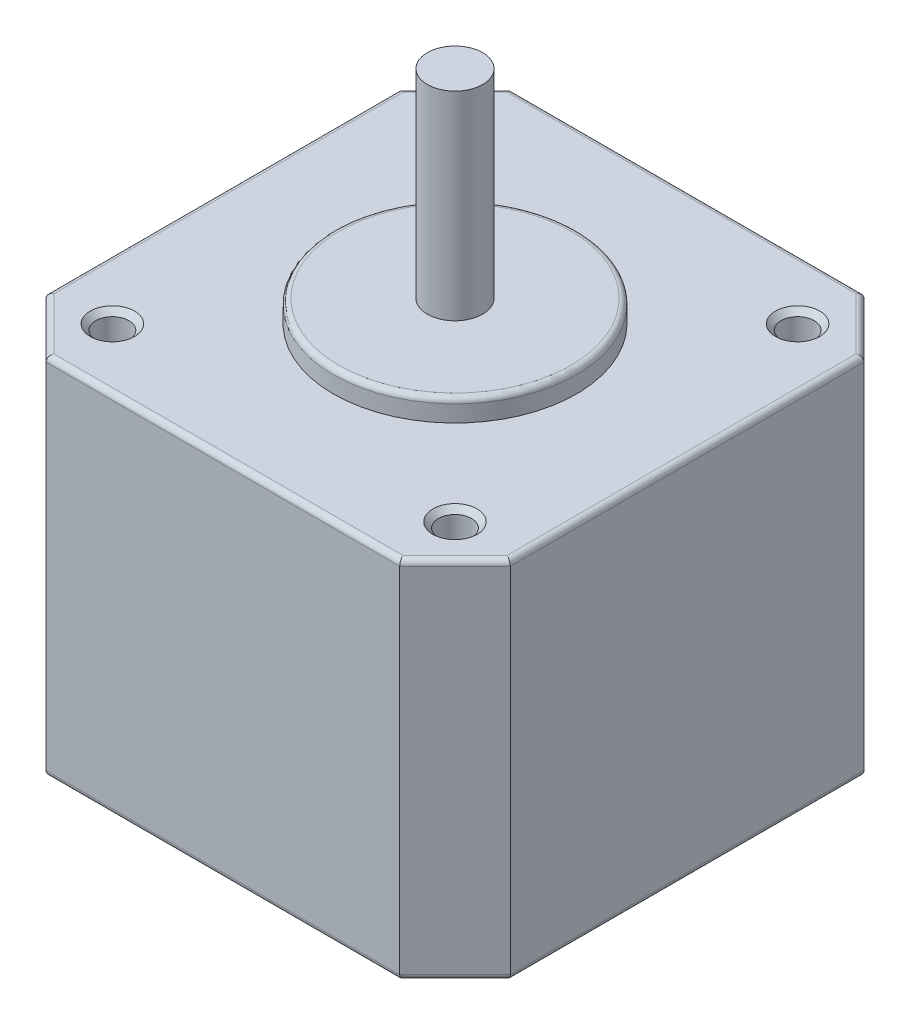
ISO-10303-21;
HEADER;
FILE_DESCRIPTION(('STEP AP214'),'2;1');
FILE_NAME('part.step','',(''),(''),'','','');
FILE_SCHEMA(('AUTOMOTIVE_DESIGN { 1 0 10303 214 1 1 1 1 }'));
ENDSEC;
DATA;
#1=APPLICATION_CONTEXT('core data for automotive mechanical design processes');
#2=APPLICATION_PROTOCOL_DEFINITION('international standard','automotive_design',2000,#1);
#3=PRODUCT_CONTEXT('',#1,'mechanical');
#4=PRODUCT('Part','Part','',(#3));
#5=PRODUCT_RELATED_PRODUCT_CATEGORY('part','',(#4));
#6=PRODUCT_DEFINITION_FORMATION('','',#4);
#7=PRODUCT_DEFINITION_CONTEXT('part definition',#1,'design');
#8=PRODUCT_DEFINITION('design','',#6,#7);
#9=PRODUCT_DEFINITION_SHAPE('','',#8);
#10=(LENGTH_UNIT() NAMED_UNIT(*) SI_UNIT(.MILLI.,.METRE.));
#11=(NAMED_UNIT(*) PLANE_ANGLE_UNIT() SI_UNIT($,.RADIAN.));
#12=(NAMED_UNIT(*) SI_UNIT($,.STERADIAN.) SOLID_ANGLE_UNIT());
#13=UNCERTAINTY_MEASURE_WITH_UNIT(LENGTH_MEASURE(1.E-05),#10,'distance_accuracy_value','');
#14=(GEOMETRIC_REPRESENTATION_CONTEXT(3) GLOBAL_UNCERTAINTY_ASSIGNED_CONTEXT((#13)) GLOBAL_UNIT_ASSIGNED_CONTEXT((#10,
#11,#12)) REPRESENTATION_CONTEXT('',''));
#15=CARTESIAN_POINT('',(0.,0.,0.));
#16=DIRECTION('',(0.,0.,1.));
#17=DIRECTION('',(1.,0.,0.));
#18=AXIS2_PLACEMENT_3D('',#15,#16,#17);
#19=CARTESIAN_POINT('',(-21.,33.,-21.));
#20=DIRECTION('',(1.,0.,0.));
#21=DIRECTION('',(0.,0.,-1.));
#22=AXIS2_PLACEMENT_3D('',#19,#20,#21);
#23=PLANE('',#22);
#24=DIRECTION('',(0.,-1.,0.));
#25=VECTOR('',#24,1.);
#26=CARTESIAN_POINT('',(-21.,33.,-16.));
#27=LINE('',#26,#25);
#28=CARTESIAN_POINT('',(-21.,32.5,-16.));
#29=VERTEX_POINT('',#28);
#30=CARTESIAN_POINT('',(-21.,0.5,-16.));
#31=VERTEX_POINT('',#30);
#32=EDGE_CURVE('E399',#29,#31,#27,.T.);
#33=ORIENTED_EDGE('',*,*,#32,.T.);
#34=DIRECTION('',(0.,0.,1.));
#35=VECTOR('',#34,1.);
#36=CARTESIAN_POINT('',(-21.,0.5,-21.));
#37=LINE('',#36,#35);
#38=CARTESIAN_POINT('',(-21.,0.5,16.));
#39=VERTEX_POINT('',#38);
#40=EDGE_CURVE('E201',#31,#39,#37,.T.);
#41=ORIENTED_EDGE('',*,*,#40,.T.);
#42=DIRECTION('',(0.,1.,0.));
#43=VECTOR('',#42,1.);
#44=CARTESIAN_POINT('',(-21.,33.,16.));
#45=LINE('',#44,#43);
#46=CARTESIAN_POINT('',(-21.,32.5,16.));
#47=VERTEX_POINT('',#46);
#48=EDGE_CURVE('E407',#39,#47,#45,.T.);
#49=ORIENTED_EDGE('',*,*,#48,.T.);
#50=DIRECTION('',(0.,0.,1.));
#51=VECTOR('',#50,1.);
#52=CARTESIAN_POINT('',(-21.,32.5,-16.));
#53=LINE('',#52,#51);
#54=EDGE_CURVE('E198',#47,#29,#53,.F.);
#55=ORIENTED_EDGE('',*,*,#54,.T.);
#56=EDGE_LOOP('',(#33,#41,#49,#55));
#57=FACE_BOUND('',#56,.T.);
#58=ADVANCED_FACE('F34',(#57),#23,.F.);
#59=CARTESIAN_POINT('',(-21.,33.,21.));
#60=DIRECTION('',(0.,0.,-1.));
#61=DIRECTION('',(-1.,0.,0.));
#62=AXIS2_PLACEMENT_3D('',#59,#60,#61);
#63=PLANE('',#62);
#64=DIRECTION('',(0.,-1.,0.));
#65=VECTOR('',#64,1.);
#66=CARTESIAN_POINT('',(-16.,33.,21.));
#67=LINE('',#66,#65);
#68=CARTESIAN_POINT('',(-16.,32.5,21.));
#69=VERTEX_POINT('',#68);
#70=CARTESIAN_POINT('',(-16.,0.5,21.));
#71=VERTEX_POINT('',#70);
#72=EDGE_CURVE('E396',#69,#71,#67,.T.);
#73=ORIENTED_EDGE('',*,*,#72,.T.);
#74=DIRECTION('',(1.,0.,0.));
#75=VECTOR('',#74,1.);
#76=CARTESIAN_POINT('',(-21.,0.5,21.));
#77=LINE('',#76,#75);
#78=CARTESIAN_POINT('',(16.,0.5,21.));
#79=VERTEX_POINT('',#78);
#80=EDGE_CURVE('E209',#71,#79,#77,.T.);
#81=ORIENTED_EDGE('',*,*,#80,.T.);
#82=DIRECTION('',(0.,1.,0.));
#83=VECTOR('',#82,1.);
#84=CARTESIAN_POINT('',(16.,33.,21.));
#85=LINE('',#84,#83);
#86=CARTESIAN_POINT('',(16.,32.5,21.));
#87=VERTEX_POINT('',#86);
#88=EDGE_CURVE('E391',#79,#87,#85,.T.);
#89=ORIENTED_EDGE('',*,*,#88,.T.);
#90=DIRECTION('',(1.,0.,0.));
#91=VECTOR('',#90,1.);
#92=CARTESIAN_POINT('',(-16.,32.5,21.));
#93=LINE('',#92,#91);
#94=EDGE_CURVE('E207',#87,#69,#93,.F.);
#95=ORIENTED_EDGE('',*,*,#94,.T.);
#96=EDGE_LOOP('',(#73,#81,#89,#95));
#97=FACE_BOUND('',#96,.T.);
#98=ADVANCED_FACE('F280',(#97),#63,.F.);
#99=CARTESIAN_POINT('',(21.,33.,-21.));
#100=DIRECTION('',(-1.,0.,0.));
#101=DIRECTION('',(0.,0.,1.));
#102=AXIS2_PLACEMENT_3D('',#99,#100,#101);
#103=PLANE('',#102);
#104=DIRECTION('',(0.,-1.,0.));
#105=VECTOR('',#104,1.);
#106=CARTESIAN_POINT('',(21.,33.,16.));
#107=LINE('',#106,#105);
#108=CARTESIAN_POINT('',(21.,32.5,16.));
#109=VERTEX_POINT('',#108);
#110=CARTESIAN_POINT('',(21.,0.5,16.));
#111=VERTEX_POINT('',#110);
#112=EDGE_CURVE('E393',#109,#111,#107,.T.);
#113=ORIENTED_EDGE('',*,*,#112,.T.);
#114=DIRECTION('',(0.,0.,-1.));
#115=VECTOR('',#114,1.);
#116=CARTESIAN_POINT('',(21.,0.5,-21.));
#117=LINE('',#116,#115);
#118=CARTESIAN_POINT('',(21.,0.5,-16.));
#119=VERTEX_POINT('',#118);
#120=EDGE_CURVE('E184',#111,#119,#117,.T.);
#121=ORIENTED_EDGE('',*,*,#120,.T.);
#122=DIRECTION('',(0.,1.,0.));
#123=VECTOR('',#122,1.);
#124=CARTESIAN_POINT('',(21.,33.,-16.));
#125=LINE('',#124,#123);
#126=CARTESIAN_POINT('',(21.,32.5,-16.));
#127=VERTEX_POINT('',#126);
#128=EDGE_CURVE('E417',#119,#127,#125,.T.);
#129=ORIENTED_EDGE('',*,*,#128,.T.);
#130=DIRECTION('',(0.,0.,-1.));
#131=VECTOR('',#130,1.);
#132=CARTESIAN_POINT('',(21.,32.5,16.));
#133=LINE('',#132,#131);
#134=EDGE_CURVE('E182',#127,#109,#133,.F.);
#135=ORIENTED_EDGE('',*,*,#134,.T.);
#136=EDGE_LOOP('',(#113,#121,#129,#135));
#137=FACE_BOUND('',#136,.T.);
#138=ADVANCED_FACE('F286',(#137),#103,.F.);
#139=CARTESIAN_POINT('',(-21.,33.,-21.));
#140=DIRECTION('',(0.,0.,1.));
#141=DIRECTION('',(1.,0.,0.));
#142=AXIS2_PLACEMENT_3D('',#139,#140,#141);
#143=PLANE('',#142);
#144=DIRECTION('',(0.,-1.,0.));
#145=VECTOR('',#144,1.);
#146=CARTESIAN_POINT('',(16.,33.,-21.));
#147=LINE('',#146,#145);
#148=CARTESIAN_POINT('',(16.,32.5,-21.));
#149=VERTEX_POINT('',#148);
#150=CARTESIAN_POINT('',(16.,0.5,-21.));
#151=VERTEX_POINT('',#150);
#152=EDGE_CURVE('E410',#149,#151,#147,.T.);
#153=ORIENTED_EDGE('',*,*,#152,.T.);
#154=DIRECTION('',(-1.,0.,0.));
#155=VECTOR('',#154,1.);
#156=CARTESIAN_POINT('',(-21.,0.5,-21.));
#157=LINE('',#156,#155);
#158=CARTESIAN_POINT('',(-16.,0.5,-21.));
#159=VERTEX_POINT('',#158);
#160=EDGE_CURVE('E192',#151,#159,#157,.T.);
#161=ORIENTED_EDGE('',*,*,#160,.T.);
#162=DIRECTION('',(0.,1.,0.));
#163=VECTOR('',#162,1.);
#164=CARTESIAN_POINT('',(-16.,33.,-21.));
#165=LINE('',#164,#163);
#166=CARTESIAN_POINT('',(-16.,32.5,-21.));
#167=VERTEX_POINT('',#166);
#168=EDGE_CURVE('E413',#159,#167,#165,.T.);
#169=ORIENTED_EDGE('',*,*,#168,.T.);
#170=DIRECTION('',(-1.,0.,0.));
#171=VECTOR('',#170,1.);
#172=CARTESIAN_POINT('',(16.,32.5,-21.));
#173=LINE('',#172,#171);
#174=EDGE_CURVE('E190',#167,#149,#173,.F.);
#175=ORIENTED_EDGE('',*,*,#174,.T.);
#176=EDGE_LOOP('',(#153,#161,#169,#175));
#177=FACE_BOUND('',#176,.T.);
#178=ADVANCED_FACE('F485',(#177),#143,.F.);
#179=CARTESIAN_POINT('',(0.,33.,0.));
#180=DIRECTION('',(0.,1.,0.));
#181=DIRECTION('',(0.,0.,1.));
#182=AXIS2_PLACEMENT_3D('',#179,#180,#181);
#183=PLANE('',#182);
#184=DIRECTION('',(-1.,0.,0.));
#185=VECTOR('',#184,1.);
#186=CARTESIAN_POINT('',(-16.,33.,-20.5));
#187=LINE('',#186,#185);
#188=CARTESIAN_POINT('',(15.7928932188135,33.,-20.5));
#189=VERTEX_POINT('',#188);
#190=CARTESIAN_POINT('',(-15.7928932188134,33.,-20.5));
#191=VERTEX_POINT('',#190);
#192=EDGE_CURVE('E49',#189,#191,#187,.T.);
#193=ORIENTED_EDGE('',*,*,#192,.T.);
#194=DIRECTION('',(0.707106781186549,0.,-0.707106781186546));
#195=VECTOR('',#194,1.);
#196=CARTESIAN_POINT('',(-18.1464466094067,33.,-18.1464466094068));
#197=LINE('',#196,#195);
#198=CARTESIAN_POINT('',(-20.5,33.,-15.7928932188134));
#199=VERTEX_POINT('',#198);
#200=EDGE_CURVE('E54',#191,#199,#197,.F.);
#201=ORIENTED_EDGE('',*,*,#200,.T.);
#202=DIRECTION('',(0.,0.,1.));
#203=VECTOR('',#202,1.);
#204=CARTESIAN_POINT('',(-20.5,33.,16.));
#205=LINE('',#204,#203);
#206=CARTESIAN_POINT('',(-20.5,33.,15.7928932188134));
#207=VERTEX_POINT('',#206);
#208=EDGE_CURVE('E221',#199,#207,#205,.T.);
#209=ORIENTED_EDGE('',*,*,#208,.T.);
#210=DIRECTION('',(-0.707106781186546,0.,-0.707106781186549));
#211=VECTOR('',#210,1.);
#212=CARTESIAN_POINT('',(-18.1464466094068,33.,18.1464466094067));
#213=LINE('',#212,#211);
#214=CARTESIAN_POINT('',(-15.7928932188134,33.,20.5));
#215=VERTEX_POINT('',#214);
#216=EDGE_CURVE('E211',#207,#215,#213,.F.);
#217=ORIENTED_EDGE('',*,*,#216,.T.);
#218=DIRECTION('',(1.,0.,0.));
#219=VECTOR('',#218,1.);
#220=CARTESIAN_POINT('',(16.,33.,20.5));
#221=LINE('',#220,#219);
#222=CARTESIAN_POINT('',(15.7928932188135,33.,20.5));
#223=VERTEX_POINT('',#222);
#224=EDGE_CURVE('E213',#215,#223,#221,.T.);
#225=ORIENTED_EDGE('',*,*,#224,.T.);
#226=DIRECTION('',(-0.707106781186548,0.,0.707106781186547));
#227=VECTOR('',#226,1.);
#228=CARTESIAN_POINT('',(18.1464466094067,33.,18.1464466094067));
#229=LINE('',#228,#227);
#230=CARTESIAN_POINT('',(20.5,33.,15.7928932188135));
#231=VERTEX_POINT('',#230);
#232=EDGE_CURVE('E215',#223,#231,#229,.F.);
#233=ORIENTED_EDGE('',*,*,#232,.T.);
#234=DIRECTION('',(0.,0.,-1.));
#235=VECTOR('',#234,1.);
#236=CARTESIAN_POINT('',(20.5,33.,-16.));
#237=LINE('',#236,#235);
#238=CARTESIAN_POINT('',(20.5,33.,-15.7928932188135));
#239=VERTEX_POINT('',#238);
#240=EDGE_CURVE('E217',#231,#239,#237,.T.);
#241=ORIENTED_EDGE('',*,*,#240,.T.);
#242=DIRECTION('',(0.707106781186547,0.,0.707106781186548));
#243=VECTOR('',#242,1.);
#244=CARTESIAN_POINT('',(18.1464466094067,33.,-18.1464466094067));
#245=LINE('',#244,#243);
#246=EDGE_CURVE('E219',#239,#189,#245,.F.);
#247=ORIENTED_EDGE('',*,*,#246,.T.);
#248=EDGE_LOOP('',(#193,#201,#209,#217,#225,#233,#241,#247));
#249=FACE_BOUND('',#248,.T.);
#250=CARTESIAN_POINT('',(15.5,33.,15.5));
#251=DIRECTION('',(0.,1.,0.));
#252=DIRECTION('',(0.,0.,1.));
#253=AXIS2_PLACEMENT_3D('',#250,#251,#252);
#254=CIRCLE('',#253,2.00000000000001);
#255=CARTESIAN_POINT('',(15.5,33.,17.5));
#256=VERTEX_POINT('',#255);
#257=EDGE_CURVE('E432',#256,#256,#254,.F.);
#258=ORIENTED_EDGE('',*,*,#257,.T.);
#259=EDGE_LOOP('',(#258));
#260=FACE_BOUND('',#259,.T.);
#261=CARTESIAN_POINT('',(-15.5,33.,15.5));
#262=DIRECTION('',(0.,1.,0.));
#263=DIRECTION('',(0.,0.,1.));
#264=AXIS2_PLACEMENT_3D('',#261,#262,#263);
#265=CIRCLE('',#264,2.00000000000001);
#266=CARTESIAN_POINT('',(-15.5,33.,17.5));
#267=VERTEX_POINT('',#266);
#268=EDGE_CURVE('E429',#267,#267,#265,.F.);
#269=ORIENTED_EDGE('',*,*,#268,.T.);
#270=EDGE_LOOP('',(#269));
#271=FACE_BOUND('',#270,.T.);
#272=CARTESIAN_POINT('',(-15.5,33.,-15.5));
#273=DIRECTION('',(0.,1.,0.));
#274=DIRECTION('',(0.,0.,1.));
#275=AXIS2_PLACEMENT_3D('',#272,#273,#274);
#276=CIRCLE('',#275,2.00000000000001);
#277=CARTESIAN_POINT('',(-15.5,33.,-13.5));
#278=VERTEX_POINT('',#277);
#279=EDGE_CURVE('E426',#278,#278,#276,.F.);
#280=ORIENTED_EDGE('',*,*,#279,.T.);
#281=EDGE_LOOP('',(#280));
#282=FACE_BOUND('',#281,.T.);
#283=CARTESIAN_POINT('',(15.5,33.,-15.5));
#284=DIRECTION('',(0.,1.,0.));
#285=DIRECTION('',(0.,0.,1.));
#286=AXIS2_PLACEMENT_3D('',#283,#284,#285);
#287=CIRCLE('',#286,2.00000000000001);
#288=CARTESIAN_POINT('',(15.5,33.,-13.5));
#289=VERTEX_POINT('',#288);
#290=EDGE_CURVE('E423',#289,#289,#287,.F.);
#291=ORIENTED_EDGE('',*,*,#290,.T.);
#292=EDGE_LOOP('',(#291));
#293=FACE_BOUND('',#292,.T.);
#294=CARTESIAN_POINT('',(0.,33.,0.));
#295=DIRECTION('',(0.,1.,0.));
#296=DIRECTION('',(0.,0.,1.));
#297=AXIS2_PLACEMENT_3D('',#294,#295,#296);
#298=CIRCLE('',#297,11.);
#299=CARTESIAN_POINT('',(0.,33.,11.));
#300=VERTEX_POINT('',#299);
#301=EDGE_CURVE('E402',#300,#300,#298,.T.);
#302=ORIENTED_EDGE('',*,*,#301,.F.);
#303=EDGE_LOOP('',(#302));
#304=FACE_BOUND('',#303,.T.);
#305=ADVANCED_FACE('F467',(#249,#260,#271,#282,#293,#304),#183,.T.);
#306=CARTESIAN_POINT('',(0.,0.,0.));
#307=DIRECTION('',(0.,1.,0.));
#308=DIRECTION('',(0.,0.,1.));
#309=AXIS2_PLACEMENT_3D('',#306,#307,#308);
#310=PLANE('',#309);
#311=DIRECTION('',(0.,0.,-1.));
#312=VECTOR('',#311,1.);
#313=CARTESIAN_POINT('',(20.5,0.,0.));
#314=LINE('',#313,#312);
#315=CARTESIAN_POINT('',(20.5,0.,-15.7928932188134));
#316=VERTEX_POINT('',#315);
#317=CARTESIAN_POINT('',(20.5,0.,15.7928932188135));
#318=VERTEX_POINT('',#317);
#319=EDGE_CURVE('E172',#316,#318,#314,.F.);
#320=ORIENTED_EDGE('',*,*,#319,.T.);
#321=DIRECTION('',(0.707106781186548,0.,-0.707106781186547));
#322=VECTOR('',#321,1.);
#323=CARTESIAN_POINT('',(15.6464466094067,0.,20.6464466094067));
#324=LINE('',#323,#322);
#325=CARTESIAN_POINT('',(15.7928932188135,0.,20.5));
#326=VERTEX_POINT('',#325);
#327=EDGE_CURVE('E152',#318,#326,#324,.F.);
#328=ORIENTED_EDGE('',*,*,#327,.T.);
#329=DIRECTION('',(1.,0.,0.));
#330=VECTOR('',#329,1.);
#331=CARTESIAN_POINT('',(0.,0.,20.5));
#332=LINE('',#331,#330);
#333=CARTESIAN_POINT('',(-15.7928932188134,0.,20.5));
#334=VERTEX_POINT('',#333);
#335=EDGE_CURVE('E161',#326,#334,#332,.F.);
#336=ORIENTED_EDGE('',*,*,#335,.T.);
#337=DIRECTION('',(0.707106781186546,0.,0.707106781186549));
#338=VECTOR('',#337,1.);
#339=CARTESIAN_POINT('',(-20.6464466094067,0.,15.6464466094067));
#340=LINE('',#339,#338);
#341=CARTESIAN_POINT('',(-20.5,0.,15.7928932188134));
#342=VERTEX_POINT('',#341);
#343=EDGE_CURVE('E167',#334,#342,#340,.F.);
#344=ORIENTED_EDGE('',*,*,#343,.T.);
#345=DIRECTION('',(0.,0.,1.));
#346=VECTOR('',#345,1.);
#347=CARTESIAN_POINT('',(-20.5,0.,0.));
#348=LINE('',#347,#346);
#349=CARTESIAN_POINT('',(-20.5,0.,-15.7928932188134));
#350=VERTEX_POINT('',#349);
#351=EDGE_CURVE('E444',#342,#350,#348,.F.);
#352=ORIENTED_EDGE('',*,*,#351,.T.);
#353=DIRECTION('',(-0.707106781186549,0.,0.707106781186546));
#354=VECTOR('',#353,1.);
#355=CARTESIAN_POINT('',(-15.6464466094067,0.,-20.6464466094067));
#356=LINE('',#355,#354);
#357=CARTESIAN_POINT('',(-15.7928932188134,0.,-20.5));
#358=VERTEX_POINT('',#357);
#359=EDGE_CURVE('E446',#350,#358,#356,.F.);
#360=ORIENTED_EDGE('',*,*,#359,.T.);
#361=DIRECTION('',(-1.,0.,0.));
#362=VECTOR('',#361,1.);
#363=CARTESIAN_POINT('',(0.,0.,-20.5));
#364=LINE('',#363,#362);
#365=CARTESIAN_POINT('',(15.7928932188135,0.,-20.5));
#366=VERTEX_POINT('',#365);
#367=EDGE_CURVE('E448',#358,#366,#364,.F.);
#368=ORIENTED_EDGE('',*,*,#367,.T.);
#369=DIRECTION('',(-0.707106781186547,0.,-0.707106781186548));
#370=VECTOR('',#369,1.);
#371=CARTESIAN_POINT('',(20.6464466094067,0.,-15.6464466094067));
#372=LINE('',#371,#370);
#373=EDGE_CURVE('E177',#366,#316,#372,.F.);
#374=ORIENTED_EDGE('',*,*,#373,.T.);
#375=EDGE_LOOP('',(#320,#328,#336,#344,#352,#360,#368,#374));
#376=FACE_BOUND('',#375,.T.);
#377=ADVANCED_FACE('F170',(#376),#310,.F.);
#378=CARTESIAN_POINT('',(0.,35.,0.));
#379=DIRECTION('',(0.,-1.,0.));
#380=DIRECTION('',(0.,0.,-1.));
#381=AXIS2_PLACEMENT_3D('',#378,#379,#380);
#382=CYLINDRICAL_SURFACE('',#381,11.);
#383=CARTESIAN_POINT('',(0.,34.5,0.));
#384=DIRECTION('',(0.,1.,0.));
#385=DIRECTION('',(0.,0.,1.));
#386=AXIS2_PLACEMENT_3D('',#383,#384,#385);
#387=CIRCLE('',#386,11.);
#388=CARTESIAN_POINT('',(0.,34.5,11.));
#389=VERTEX_POINT('',#388);
#390=EDGE_CURVE('E11',#389,#389,#387,.F.);
#391=ORIENTED_EDGE('',*,*,#390,.T.);
#392=EDGE_LOOP('',(#391));
#393=FACE_BOUND('',#392,.T.);
#394=ORIENTED_EDGE('',*,*,#301,.T.);
#395=EDGE_LOOP('',(#394));
#396=FACE_BOUND('',#395,.T.);
#397=ADVANCED_FACE('F495',(#393,#396),#382,.T.);
#398=CARTESIAN_POINT('',(0.,35.,0.));
#399=DIRECTION('',(0.,1.,0.));
#400=DIRECTION('',(0.,0.,1.));
#401=AXIS2_PLACEMENT_3D('',#398,#399,#400);
#402=PLANE('',#401);
#403=CARTESIAN_POINT('',(0.,35.,0.));
#404=DIRECTION('',(0.,1.,0.));
#405=DIRECTION('',(0.,0.,1.));
#406=AXIS2_PLACEMENT_3D('',#403,#404,#405);
#407=CIRCLE('',#406,10.5);
#408=CARTESIAN_POINT('',(0.,35.,10.5));
#409=VERTEX_POINT('',#408);
#410=EDGE_CURVE('E42',#409,#409,#407,.T.);
#411=ORIENTED_EDGE('',*,*,#410,.T.);
#412=EDGE_LOOP('',(#411));
#413=FACE_BOUND('',#412,.T.);
#414=CARTESIAN_POINT('',(0.,35.,0.));
#415=DIRECTION('',(0.,1.,0.));
#416=DIRECTION('',(0.,0.,1.));
#417=AXIS2_PLACEMENT_3D('',#414,#415,#416);
#418=CIRCLE('',#417,2.5);
#419=CARTESIAN_POINT('',(0.,35.,2.5));
#420=VERTEX_POINT('',#419);
#421=EDGE_CURVE('E397',#420,#420,#418,.T.);
#422=ORIENTED_EDGE('',*,*,#421,.F.);
#423=EDGE_LOOP('',(#422));
#424=FACE_BOUND('',#423,.T.);
#425=ADVANCED_FACE('F266',(#413,#424),#402,.T.);
#426=CARTESIAN_POINT('',(0.,53.,0.));
#427=DIRECTION('',(0.,-1.,0.));
#428=DIRECTION('',(0.,0.,-1.));
#429=AXIS2_PLACEMENT_3D('',#426,#427,#428);
#430=CYLINDRICAL_SURFACE('',#429,2.5);
#431=CARTESIAN_POINT('',(0.,53.,0.));
#432=DIRECTION('',(0.,1.,0.));
#433=DIRECTION('',(0.,0.,1.));
#434=AXIS2_PLACEMENT_3D('',#431,#432,#433);
#435=CIRCLE('',#434,2.5);
#436=CARTESIAN_POINT('',(0.,53.,2.5));
#437=VERTEX_POINT('',#436);
#438=EDGE_CURVE('E551',#437,#437,#435,.T.);
#439=ORIENTED_EDGE('',*,*,#438,.F.);
#440=EDGE_LOOP('',(#439));
#441=FACE_BOUND('',#440,.T.);
#442=ORIENTED_EDGE('',*,*,#421,.T.);
#443=EDGE_LOOP('',(#442));
#444=FACE_BOUND('',#443,.T.);
#445=ADVANCED_FACE('F502',(#441,#444),#430,.T.);
#446=CARTESIAN_POINT('',(0.,53.,0.));
#447=DIRECTION('',(0.,1.,0.));
#448=DIRECTION('',(0.,0.,1.));
#449=AXIS2_PLACEMENT_3D('',#446,#447,#448);
#450=PLANE('',#449);
#451=ORIENTED_EDGE('',*,*,#438,.T.);
#452=EDGE_LOOP('',(#451));
#453=FACE_BOUND('',#452,.T.);
#454=ADVANCED_FACE('F505',(#453),#450,.T.);
#455=CARTESIAN_POINT('',(-15.5,28.,15.5));
#456=DIRECTION('',(0.,1.,0.));
#457=DIRECTION('',(0.,0.,1.));
#458=AXIS2_PLACEMENT_3D('',#455,#456,#457);
#459=CYLINDRICAL_SURFACE('',#458,1.5);
#460=CARTESIAN_POINT('',(-15.5,32.5,15.5));
#461=DIRECTION('',(0.,1.,0.));
#462=DIRECTION('',(0.,0.,1.));
#463=AXIS2_PLACEMENT_3D('',#460,#461,#462);
#464=CIRCLE('',#463,1.5);
#465=CARTESIAN_POINT('',(-15.5,32.5,17.));
#466=VERTEX_POINT('',#465);
#467=EDGE_CURVE('E435',#466,#466,#464,.T.);
#468=ORIENTED_EDGE('',*,*,#467,.T.);
#469=EDGE_LOOP('',(#468));
#470=FACE_BOUND('',#469,.T.);
#471=CARTESIAN_POINT('',(-15.5,28.,15.5));
#472=DIRECTION('',(0.,1.,0.));
#473=DIRECTION('',(0.,0.,1.));
#474=AXIS2_PLACEMENT_3D('',#471,#472,#473);
#475=CIRCLE('',#474,1.5);
#476=CARTESIAN_POINT('',(-15.5,28.,17.));
#477=VERTEX_POINT('',#476);
#478=EDGE_CURVE('E547',#477,#477,#475,.T.);
#479=ORIENTED_EDGE('',*,*,#478,.F.);
#480=EDGE_LOOP('',(#479));
#481=FACE_BOUND('',#480,.T.);
#482=ADVANCED_FACE('F509',(#470,#481),#459,.F.);
#483=CARTESIAN_POINT('',(-15.5,28.,15.5));
#484=DIRECTION('',(0.,1.,0.));
#485=DIRECTION('',(0.,0.,1.));
#486=AXIS2_PLACEMENT_3D('',#483,#484,#485);
#487=PLANE('',#486);
#488=ORIENTED_EDGE('',*,*,#478,.T.);
#489=EDGE_LOOP('',(#488));
#490=FACE_BOUND('',#489,.T.);
#491=ADVANCED_FACE('F513',(#490),#487,.T.);
#492=CARTESIAN_POINT('',(15.5,28.,15.5));
#493=DIRECTION('',(0.,1.,0.));
#494=DIRECTION('',(0.,0.,1.));
#495=AXIS2_PLACEMENT_3D('',#492,#493,#494);
#496=CYLINDRICAL_SURFACE('',#495,1.5);
#497=CARTESIAN_POINT('',(15.5,32.5,15.5));
#498=DIRECTION('',(0.,1.,0.));
#499=DIRECTION('',(0.,0.,1.));
#500=AXIS2_PLACEMENT_3D('',#497,#498,#499);
#501=CIRCLE('',#500,1.5);
#502=CARTESIAN_POINT('',(15.5,32.5,17.));
#503=VERTEX_POINT('',#502);
#504=EDGE_CURVE('E420',#503,#503,#501,.T.);
#505=ORIENTED_EDGE('',*,*,#504,.T.);
#506=EDGE_LOOP('',(#505));
#507=FACE_BOUND('',#506,.T.);
#508=CARTESIAN_POINT('',(15.5,28.,15.5));
#509=DIRECTION('',(0.,1.,0.));
#510=DIRECTION('',(0.,0.,1.));
#511=AXIS2_PLACEMENT_3D('',#508,#509,#510);
#512=CIRCLE('',#511,1.5);
#513=CARTESIAN_POINT('',(15.5,28.,17.));
#514=VERTEX_POINT('',#513);
#515=EDGE_CURVE('E546',#514,#514,#512,.T.);
#516=ORIENTED_EDGE('',*,*,#515,.F.);
#517=EDGE_LOOP('',(#516));
#518=FACE_BOUND('',#517,.T.);
#519=ADVANCED_FACE('F517',(#507,#518),#496,.F.);
#520=CARTESIAN_POINT('',(15.5,28.,15.5));
#521=DIRECTION('',(0.,1.,0.));
#522=DIRECTION('',(0.,0.,1.));
#523=AXIS2_PLACEMENT_3D('',#520,#521,#522);
#524=PLANE('',#523);
#525=ORIENTED_EDGE('',*,*,#515,.T.);
#526=EDGE_LOOP('',(#525));
#527=FACE_BOUND('',#526,.T.);
#528=ADVANCED_FACE('F533',(#527),#524,.T.);
#529=CARTESIAN_POINT('',(15.5,28.,-15.5));
#530=DIRECTION('',(0.,1.,0.));
#531=DIRECTION('',(0.,0.,1.));
#532=AXIS2_PLACEMENT_3D('',#529,#530,#531);
#533=CYLINDRICAL_SURFACE('',#532,1.5);
#534=CARTESIAN_POINT('',(15.5,32.5,-15.5));
#535=DIRECTION('',(0.,1.,0.));
#536=DIRECTION('',(0.,0.,1.));
#537=AXIS2_PLACEMENT_3D('',#534,#535,#536);
#538=CIRCLE('',#537,1.5);
#539=CARTESIAN_POINT('',(15.5,32.5,-14.));
#540=VERTEX_POINT('',#539);
#541=EDGE_CURVE('E168',#540,#540,#538,.T.);
#542=ORIENTED_EDGE('',*,*,#541,.T.);
#543=EDGE_LOOP('',(#542));
#544=FACE_BOUND('',#543,.T.);
#545=CARTESIAN_POINT('',(15.5,28.,-15.5));
#546=DIRECTION('',(0.,1.,0.));
#547=DIRECTION('',(0.,0.,1.));
#548=AXIS2_PLACEMENT_3D('',#545,#546,#547);
#549=CIRCLE('',#548,1.5);
#550=CARTESIAN_POINT('',(15.5,28.,-14.));
#551=VERTEX_POINT('',#550);
#552=EDGE_CURVE('E548',#551,#551,#549,.T.);
#553=ORIENTED_EDGE('',*,*,#552,.F.);
#554=EDGE_LOOP('',(#553));
#555=FACE_BOUND('',#554,.T.);
#556=ADVANCED_FACE('F529',(#544,#555),#533,.F.);
#557=CARTESIAN_POINT('',(15.5,28.,-15.5));
#558=DIRECTION('',(0.,1.,0.));
#559=DIRECTION('',(0.,0.,1.));
#560=AXIS2_PLACEMENT_3D('',#557,#558,#559);
#561=PLANE('',#560);
#562=ORIENTED_EDGE('',*,*,#552,.T.);
#563=EDGE_LOOP('',(#562));
#564=FACE_BOUND('',#563,.T.);
#565=ADVANCED_FACE('F525',(#564),#561,.T.);
#566=CARTESIAN_POINT('',(-15.5,28.,-15.5));
#567=DIRECTION('',(0.,1.,0.));
#568=DIRECTION('',(0.,0.,1.));
#569=AXIS2_PLACEMENT_3D('',#566,#567,#568);
#570=CYLINDRICAL_SURFACE('',#569,1.5);
#571=CARTESIAN_POINT('',(-15.5,32.5,-15.5));
#572=DIRECTION('',(0.,1.,0.));
#573=DIRECTION('',(0.,0.,1.));
#574=AXIS2_PLACEMENT_3D('',#571,#572,#573);
#575=CIRCLE('',#574,1.5);
#576=CARTESIAN_POINT('',(-15.5,32.5,-14.));
#577=VERTEX_POINT('',#576);
#578=EDGE_CURVE('E438',#577,#577,#575,.T.);
#579=ORIENTED_EDGE('',*,*,#578,.T.);
#580=EDGE_LOOP('',(#579));
#581=FACE_BOUND('',#580,.T.);
#582=CARTESIAN_POINT('',(-15.5,28.,-15.5));
#583=DIRECTION('',(0.,1.,0.));
#584=DIRECTION('',(0.,0.,1.));
#585=AXIS2_PLACEMENT_3D('',#582,#583,#584);
#586=CIRCLE('',#585,1.5);
#587=CARTESIAN_POINT('',(-15.5,28.,-14.));
#588=VERTEX_POINT('',#587);
#589=EDGE_CURVE('E242',#588,#588,#586,.T.);
#590=ORIENTED_EDGE('',*,*,#589,.F.);
#591=EDGE_LOOP('',(#590));
#592=FACE_BOUND('',#591,.T.);
#593=ADVANCED_FACE('F521',(#581,#592),#570,.F.);
#594=CARTESIAN_POINT('',(-15.5,28.,-15.5));
#595=DIRECTION('',(0.,1.,0.));
#596=DIRECTION('',(0.,0.,1.));
#597=AXIS2_PLACEMENT_3D('',#594,#595,#596);
#598=PLANE('',#597);
#599=ORIENTED_EDGE('',*,*,#589,.T.);
#600=EDGE_LOOP('',(#599));
#601=FACE_BOUND('',#600,.T.);
#602=ADVANCED_FACE('F296',(#601),#598,.T.);
#603=CARTESIAN_POINT('',(-16.,33.,21.));
#604=DIRECTION('',(0.707106781186549,0.,-0.707106781186546));
#605=DIRECTION('',(0.,-1.,0.));
#606=AXIS2_PLACEMENT_3D('',#603,#604,#605);
#607=PLANE('',#606);
#608=ORIENTED_EDGE('',*,*,#48,.F.);
#609=DIRECTION('',(-0.707106781186546,0.,-0.707106781186549));
#610=VECTOR('',#609,1.);
#611=CARTESIAN_POINT('',(-16.,0.5,21.));
#612=LINE('',#611,#610);
#613=EDGE_CURVE('E205',#39,#71,#612,.F.);
#614=ORIENTED_EDGE('',*,*,#613,.T.);
#615=ORIENTED_EDGE('',*,*,#72,.F.);
#616=DIRECTION('',(0.707106781186546,0.,0.707106781186549));
#617=VECTOR('',#616,1.);
#618=CARTESIAN_POINT('',(-16.,32.5,21.));
#619=LINE('',#618,#617);
#620=EDGE_CURVE('E203',#69,#47,#619,.F.);
#621=ORIENTED_EDGE('',*,*,#620,.T.);
#622=EDGE_LOOP('',(#608,#614,#615,#621));
#623=FACE_BOUND('',#622,.T.);
#624=ADVANCED_FACE('F292',(#623),#607,.F.);
#625=CARTESIAN_POINT('',(-21.,33.,-16.));
#626=DIRECTION('',(0.707106781186546,0.,0.707106781186549));
#627=DIRECTION('',(0.,-1.,0.));
#628=AXIS2_PLACEMENT_3D('',#625,#626,#627);
#629=PLANE('',#628);
#630=ORIENTED_EDGE('',*,*,#168,.F.);
#631=DIRECTION('',(0.707106781186549,0.,-0.707106781186546));
#632=VECTOR('',#631,1.);
#633=CARTESIAN_POINT('',(-21.,0.5,-16.));
#634=LINE('',#633,#632);
#635=EDGE_CURVE('E196',#159,#31,#634,.F.);
#636=ORIENTED_EDGE('',*,*,#635,.T.);
#637=ORIENTED_EDGE('',*,*,#32,.F.);
#638=DIRECTION('',(-0.707106781186549,0.,0.707106781186546));
#639=VECTOR('',#638,1.);
#640=CARTESIAN_POINT('',(-21.,32.5,-16.));
#641=LINE('',#640,#639);
#642=EDGE_CURVE('E194',#29,#167,#641,.F.);
#643=ORIENTED_EDGE('',*,*,#642,.T.);
#644=EDGE_LOOP('',(#630,#636,#637,#643));
#645=FACE_BOUND('',#644,.T.);
#646=ADVANCED_FACE('F295',(#645),#629,.F.);
#647=CARTESIAN_POINT('',(16.,33.,-21.));
#648=DIRECTION('',(-0.707106781186548,0.,0.707106781186547));
#649=DIRECTION('',(0.,-1.,0.));
#650=AXIS2_PLACEMENT_3D('',#647,#648,#649);
#651=PLANE('',#650);
#652=ORIENTED_EDGE('',*,*,#128,.F.);
#653=DIRECTION('',(0.707106781186547,0.,0.707106781186548));
#654=VECTOR('',#653,1.);
#655=CARTESIAN_POINT('',(16.,0.5,-21.));
#656=LINE('',#655,#654);
#657=EDGE_CURVE('E188',#119,#151,#656,.F.);
#658=ORIENTED_EDGE('',*,*,#657,.T.);
#659=ORIENTED_EDGE('',*,*,#152,.F.);
#660=DIRECTION('',(-0.707106781186547,0.,-0.707106781186548));
#661=VECTOR('',#660,1.);
#662=CARTESIAN_POINT('',(16.,32.5,-21.));
#663=LINE('',#662,#661);
#664=EDGE_CURVE('E186',#149,#127,#663,.F.);
#665=ORIENTED_EDGE('',*,*,#664,.T.);
#666=EDGE_LOOP('',(#652,#658,#659,#665));
#667=FACE_BOUND('',#666,.T.);
#668=ADVANCED_FACE('F300',(#667),#651,.F.);
#669=CARTESIAN_POINT('',(21.,33.,16.));
#670=DIRECTION('',(-0.707106781186547,0.,-0.707106781186548));
#671=DIRECTION('',(0.,-1.,0.));
#672=AXIS2_PLACEMENT_3D('',#669,#670,#671);
#673=PLANE('',#672);
#674=ORIENTED_EDGE('',*,*,#88,.F.);
#675=DIRECTION('',(-0.707106781186548,0.,0.707106781186547));
#676=VECTOR('',#675,1.);
#677=CARTESIAN_POINT('',(21.,0.5,16.));
#678=LINE('',#677,#676);
#679=EDGE_CURVE('E154',#79,#111,#678,.F.);
#680=ORIENTED_EDGE('',*,*,#679,.T.);
#681=ORIENTED_EDGE('',*,*,#112,.F.);
#682=DIRECTION('',(0.707106781186548,0.,-0.707106781186547));
#683=VECTOR('',#682,1.);
#684=CARTESIAN_POINT('',(21.,32.5,16.));
#685=LINE('',#684,#683);
#686=EDGE_CURVE('E174',#109,#87,#685,.F.);
#687=ORIENTED_EDGE('',*,*,#686,.T.);
#688=EDGE_LOOP('',(#674,#680,#681,#687));
#689=FACE_BOUND('',#688,.T.);
#690=ADVANCED_FACE('F304',(#689),#673,.F.);
#691=CARTESIAN_POINT('',(15.5,32.5,15.5));
#692=DIRECTION('',(0.,1.,0.));
#693=DIRECTION('',(0.,0.,1.));
#694=AXIS2_PLACEMENT_3D('',#691,#692,#693);
#695=CONICAL_SURFACE('',#694,1.5,0.785398163397449);
#696=ORIENTED_EDGE('',*,*,#257,.F.);
#697=EDGE_LOOP('',(#696));
#698=FACE_BOUND('',#697,.T.);
#699=ORIENTED_EDGE('',*,*,#504,.F.);
#700=EDGE_LOOP('',(#699));
#701=FACE_BOUND('',#700,.T.);
#702=ADVANCED_FACE('F308',(#698,#701),#695,.F.);
#703=CARTESIAN_POINT('',(-15.5,32.5,15.5));
#704=DIRECTION('',(0.,1.,0.));
#705=DIRECTION('',(0.,0.,1.));
#706=AXIS2_PLACEMENT_3D('',#703,#704,#705);
#707=CONICAL_SURFACE('',#706,1.5,0.785398163397449);
#708=ORIENTED_EDGE('',*,*,#268,.F.);
#709=EDGE_LOOP('',(#708));
#710=FACE_BOUND('',#709,.T.);
#711=ORIENTED_EDGE('',*,*,#467,.F.);
#712=EDGE_LOOP('',(#711));
#713=FACE_BOUND('',#712,.T.);
#714=ADVANCED_FACE('F312',(#710,#713),#707,.F.);
#715=CARTESIAN_POINT('',(-15.5,32.5,-15.5));
#716=DIRECTION('',(0.,1.,0.));
#717=DIRECTION('',(0.,0.,1.));
#718=AXIS2_PLACEMENT_3D('',#715,#716,#717);
#719=CONICAL_SURFACE('',#718,1.5,0.785398163397449);
#720=ORIENTED_EDGE('',*,*,#279,.F.);
#721=EDGE_LOOP('',(#720));
#722=FACE_BOUND('',#721,.T.);
#723=ORIENTED_EDGE('',*,*,#578,.F.);
#724=EDGE_LOOP('',(#723));
#725=FACE_BOUND('',#724,.T.);
#726=ADVANCED_FACE('F316',(#722,#725),#719,.F.);
#727=CARTESIAN_POINT('',(15.5,32.5,-15.5));
#728=DIRECTION('',(0.,1.,0.));
#729=DIRECTION('',(0.,0.,1.));
#730=AXIS2_PLACEMENT_3D('',#727,#728,#729);
#731=CONICAL_SURFACE('',#730,1.5,0.785398163397449);
#732=ORIENTED_EDGE('',*,*,#290,.F.);
#733=EDGE_LOOP('',(#732));
#734=FACE_BOUND('',#733,.T.);
#735=ORIENTED_EDGE('',*,*,#541,.F.);
#736=EDGE_LOOP('',(#735));
#737=FACE_BOUND('',#736,.T.);
#738=ADVANCED_FACE('F320',(#734,#737),#731,.F.);
#739=CARTESIAN_POINT('',(-18.1464466094067,0.5,-18.1464466094068));
#740=DIRECTION('',(0.707106781186549,0.,-0.707106781186546));
#741=DIRECTION('',(-0.707106781186546,0.,-0.707106781186549));
#742=AXIS2_PLACEMENT_3D('',#739,#740,#741);
#743=CYLINDRICAL_SURFACE('',#742,0.5);
#744=CARTESIAN_POINT('',(-20.5,0.5,-15.7928932188134));
#745=DIRECTION('',(-0.382683432365091,0.,0.923879532511286));
#746=DIRECTION('',(0.923879532511286,0.,0.382683432365091));
#747=AXIS2_PLACEMENT_3D('',#744,#745,#746);
#748=ELLIPSE('',#747,0.541196100146197,0.5);
#749=EDGE_CURVE('E236',#31,#350,#748,.T.);
#750=ORIENTED_EDGE('',*,*,#749,.F.);
#751=ORIENTED_EDGE('',*,*,#635,.F.);
#752=CARTESIAN_POINT('',(-15.7928932188134,0.5,-20.5));
#753=DIRECTION('',(0.923879532511287,0.,-0.382683432365089));
#754=DIRECTION('',(-0.382683432365089,0.,-0.923879532511287));
#755=AXIS2_PLACEMENT_3D('',#752,#753,#754);
#756=ELLIPSE('',#755,0.541196100146197,0.5);
#757=EDGE_CURVE('E239',#358,#159,#756,.T.);
#758=ORIENTED_EDGE('',*,*,#757,.F.);
#759=ORIENTED_EDGE('',*,*,#359,.F.);
#760=EDGE_LOOP('',(#750,#751,#758,#759));
#761=FACE_BOUND('',#760,.T.);
#762=ADVANCED_FACE('F324',(#761),#743,.T.);
#763=CARTESIAN_POINT('',(-21.,0.5,-20.5));
#764=DIRECTION('',(-1.,0.,0.));
#765=DIRECTION('',(0.,0.,1.));
#766=AXIS2_PLACEMENT_3D('',#763,#764,#765);
#767=CYLINDRICAL_SURFACE('',#766,0.5);
#768=ORIENTED_EDGE('',*,*,#757,.T.);
#769=ORIENTED_EDGE('',*,*,#160,.F.);
#770=CARTESIAN_POINT('',(15.7928932188135,0.5,-20.5));
#771=DIRECTION('',(-0.923879532511287,0.,-0.38268343236509));
#772=DIRECTION('',(-0.38268343236509,0.,0.923879532511286));
#773=AXIS2_PLACEMENT_3D('',#770,#771,#772);
#774=ELLIPSE('',#773,0.541196100146197,0.5);
#775=EDGE_CURVE('E233',#366,#151,#774,.F.);
#776=ORIENTED_EDGE('',*,*,#775,.F.);
#777=ORIENTED_EDGE('',*,*,#367,.F.);
#778=EDGE_LOOP('',(#768,#769,#776,#777));
#779=FACE_BOUND('',#778,.T.);
#780=ADVANCED_FACE('F346',(#779),#767,.T.);
#781=CARTESIAN_POINT('',(-20.5,0.5,-21.));
#782=DIRECTION('',(0.,0.,1.));
#783=DIRECTION('',(1.,0.,0.));
#784=AXIS2_PLACEMENT_3D('',#781,#782,#783);
#785=CYLINDRICAL_SURFACE('',#784,0.5);
#786=ORIENTED_EDGE('',*,*,#749,.T.);
#787=ORIENTED_EDGE('',*,*,#351,.F.);
#788=CARTESIAN_POINT('',(-20.5,0.5,15.7928932188134));
#789=DIRECTION('',(-0.382683432365089,0.,-0.923879532511287));
#790=DIRECTION('',(-0.923879532511287,0.,0.382683432365089));
#791=AXIS2_PLACEMENT_3D('',#788,#789,#790);
#792=ELLIPSE('',#791,0.541196100146197,0.5);
#793=EDGE_CURVE('E230',#39,#342,#792,.F.);
#794=ORIENTED_EDGE('',*,*,#793,.F.);
#795=ORIENTED_EDGE('',*,*,#40,.F.);
#796=EDGE_LOOP('',(#786,#787,#794,#795));
#797=FACE_BOUND('',#796,.T.);
#798=ADVANCED_FACE('F342',(#797),#785,.T.);
#799=CARTESIAN_POINT('',(18.1464466094067,0.5,-18.1464466094067));
#800=DIRECTION('',(0.707106781186547,0.,0.707106781186548));
#801=DIRECTION('',(0.707106781186548,0.,-0.707106781186547));
#802=AXIS2_PLACEMENT_3D('',#799,#800,#801);
#803=CYLINDRICAL_SURFACE('',#802,0.5);
#804=ORIENTED_EDGE('',*,*,#775,.T.);
#805=ORIENTED_EDGE('',*,*,#657,.F.);
#806=CARTESIAN_POINT('',(20.5,0.5,-15.7928932188134));
#807=DIRECTION('',(0.382683432365089,0.,0.923879532511287));
#808=DIRECTION('',(0.923879532511287,0.,-0.382683432365089));
#809=AXIS2_PLACEMENT_3D('',#806,#807,#808);
#810=ELLIPSE('',#809,0.541196100146197,0.5);
#811=EDGE_CURVE('E227',#316,#119,#810,.T.);
#812=ORIENTED_EDGE('',*,*,#811,.F.);
#813=ORIENTED_EDGE('',*,*,#373,.F.);
#814=EDGE_LOOP('',(#804,#805,#812,#813));
#815=FACE_BOUND('',#814,.T.);
#816=ADVANCED_FACE('F338',(#815),#803,.T.);
#817=CARTESIAN_POINT('',(-18.1464466094068,0.5,18.1464466094067));
#818=DIRECTION('',(-0.707106781186546,0.,-0.707106781186549));
#819=DIRECTION('',(-0.707106781186549,0.,0.707106781186546));
#820=AXIS2_PLACEMENT_3D('',#817,#818,#819);
#821=CYLINDRICAL_SURFACE('',#820,0.5);
#822=ORIENTED_EDGE('',*,*,#793,.T.);
#823=ORIENTED_EDGE('',*,*,#343,.F.);
#824=CARTESIAN_POINT('',(-15.7928932188134,0.5,20.5));
#825=DIRECTION('',(0.923879532511287,0.,0.382683432365091));
#826=DIRECTION('',(0.382683432365091,0.,-0.923879532511287));
#827=AXIS2_PLACEMENT_3D('',#824,#825,#826);
#828=ELLIPSE('',#827,0.541196100146197,0.5);
#829=EDGE_CURVE('E164',#71,#334,#828,.T.);
#830=ORIENTED_EDGE('',*,*,#829,.F.);
#831=ORIENTED_EDGE('',*,*,#613,.F.);
#832=EDGE_LOOP('',(#822,#823,#830,#831));
#833=FACE_BOUND('',#832,.T.);
#834=ADVANCED_FACE('F334',(#833),#821,.T.);
#835=CARTESIAN_POINT('',(20.5,0.5,-21.));
#836=DIRECTION('',(0.,0.,-1.));
#837=DIRECTION('',(-1.,0.,0.));
#838=AXIS2_PLACEMENT_3D('',#835,#836,#837);
#839=CYLINDRICAL_SURFACE('',#838,0.5);
#840=ORIENTED_EDGE('',*,*,#811,.T.);
#841=ORIENTED_EDGE('',*,*,#120,.F.);
#842=CARTESIAN_POINT('',(20.5,0.5,15.7928932188135));
#843=DIRECTION('',(0.38268343236509,0.,-0.923879532511287));
#844=DIRECTION('',(-0.923879532511286,0.,-0.38268343236509));
#845=AXIS2_PLACEMENT_3D('',#842,#843,#844);
#846=ELLIPSE('',#845,0.541196100146197,0.5);
#847=EDGE_CURVE('E157',#318,#111,#846,.F.);
#848=ORIENTED_EDGE('',*,*,#847,.F.);
#849=ORIENTED_EDGE('',*,*,#319,.F.);
#850=EDGE_LOOP('',(#840,#841,#848,#849));
#851=FACE_BOUND('',#850,.T.);
#852=ADVANCED_FACE('F331',(#851),#839,.T.);
#853=CARTESIAN_POINT('',(-21.,0.5,20.5));
#854=DIRECTION('',(1.,0.,0.));
#855=DIRECTION('',(0.,0.,-1.));
#856=AXIS2_PLACEMENT_3D('',#853,#854,#855);
#857=CYLINDRICAL_SURFACE('',#856,0.5);
#858=ORIENTED_EDGE('',*,*,#829,.T.);
#859=ORIENTED_EDGE('',*,*,#335,.F.);
#860=CARTESIAN_POINT('',(15.7928932188135,0.5,20.5));
#861=DIRECTION('',(0.923879532511287,0.,-0.382683432365089));
#862=DIRECTION('',(0.382683432365089,0.,0.923879532511287));
#863=AXIS2_PLACEMENT_3D('',#860,#861,#862);
#864=ELLIPSE('',#863,0.541196100146197,0.5);
#865=EDGE_CURVE('E148',#79,#326,#864,.T.);
#866=ORIENTED_EDGE('',*,*,#865,.F.);
#867=ORIENTED_EDGE('',*,*,#80,.F.);
#868=EDGE_LOOP('',(#858,#859,#866,#867));
#869=FACE_BOUND('',#868,.T.);
#870=ADVANCED_FACE('F162',(#869),#857,.T.);
#871=CARTESIAN_POINT('',(18.1464466094067,0.5,18.1464466094068));
#872=DIRECTION('',(-0.707106781186548,0.,0.707106781186547));
#873=DIRECTION('',(0.707106781186547,0.,0.707106781186548));
#874=AXIS2_PLACEMENT_3D('',#871,#872,#873);
#875=CYLINDRICAL_SURFACE('',#874,0.5);
#876=ORIENTED_EDGE('',*,*,#847,.T.);
#877=ORIENTED_EDGE('',*,*,#679,.F.);
#878=ORIENTED_EDGE('',*,*,#865,.T.);
#879=ORIENTED_EDGE('',*,*,#327,.F.);
#880=EDGE_LOOP('',(#876,#877,#878,#879));
#881=FACE_BOUND('',#880,.T.);
#882=ADVANCED_FACE('F150',(#881),#875,.T.);
#883=CARTESIAN_POINT('',(20.5,32.5,0.));
#884=DIRECTION('',(0.,0.,1.));
#885=DIRECTION('',(1.,0.,0.));
#886=AXIS2_PLACEMENT_3D('',#883,#884,#885);
#887=CYLINDRICAL_SURFACE('',#886,0.5);
#888=CARTESIAN_POINT('',(20.5,32.5,15.7928932188135));
#889=DIRECTION('',(-0.38268343236509,0.,0.923879532511287));
#890=DIRECTION('',(-0.923879532511286,0.,-0.38268343236509));
#891=AXIS2_PLACEMENT_3D('',#888,#889,#890);
#892=ELLIPSE('',#891,0.541196100146197,0.5);
#893=EDGE_CURVE('E259',#109,#231,#892,.T.);
#894=ORIENTED_EDGE('',*,*,#893,.F.);
#895=ORIENTED_EDGE('',*,*,#134,.F.);
#896=CARTESIAN_POINT('',(20.5,32.5,-15.7928932188134));
#897=DIRECTION('',(0.382683432365089,0.,0.923879532511287));
#898=DIRECTION('',(-0.923879532511287,0.,0.382683432365089));
#899=AXIS2_PLACEMENT_3D('',#896,#897,#898);
#900=ELLIPSE('',#899,0.541196100146197,0.5);
#901=EDGE_CURVE('E158',#239,#127,#900,.F.);
#902=ORIENTED_EDGE('',*,*,#901,.F.);
#903=ORIENTED_EDGE('',*,*,#240,.F.);
#904=EDGE_LOOP('',(#894,#895,#902,#903));
#905=FACE_BOUND('',#904,.T.);
#906=ADVANCED_FACE('F328',(#905),#887,.T.);
#907=CARTESIAN_POINT('',(18.1464466094067,32.5,-18.1464466094067));
#908=DIRECTION('',(0.707106781186547,0.,0.707106781186548));
#909=DIRECTION('',(0.707106781186548,0.,-0.707106781186547));
#910=AXIS2_PLACEMENT_3D('',#907,#908,#909);
#911=CYLINDRICAL_SURFACE('',#910,0.5);
#912=ORIENTED_EDGE('',*,*,#901,.T.);
#913=ORIENTED_EDGE('',*,*,#664,.F.);
#914=CARTESIAN_POINT('',(15.7928932188135,32.5,-20.5));
#915=DIRECTION('',(0.923879532511287,0.,0.38268343236509));
#916=DIRECTION('',(0.38268343236509,0.,-0.923879532511286));
#917=AXIS2_PLACEMENT_3D('',#914,#915,#916);
#918=ELLIPSE('',#917,0.541196100146197,0.5);
#919=EDGE_CURVE('E256',#189,#149,#918,.F.);
#920=ORIENTED_EDGE('',*,*,#919,.F.);
#921=ORIENTED_EDGE('',*,*,#246,.F.);
#922=EDGE_LOOP('',(#912,#913,#920,#921));
#923=FACE_BOUND('',#922,.T.);
#924=ADVANCED_FACE('F372',(#923),#911,.T.);
#925=CARTESIAN_POINT('',(18.1464466094067,32.5,18.1464466094068));
#926=DIRECTION('',(-0.707106781186548,0.,0.707106781186547));
#927=DIRECTION('',(0.707106781186547,0.,0.707106781186548));
#928=AXIS2_PLACEMENT_3D('',#925,#926,#927);
#929=CYLINDRICAL_SURFACE('',#928,0.5);
#930=ORIENTED_EDGE('',*,*,#893,.T.);
#931=ORIENTED_EDGE('',*,*,#232,.F.);
#932=CARTESIAN_POINT('',(15.7928932188135,32.5,20.5));
#933=DIRECTION('',(-0.923879532511287,0.,0.382683432365089));
#934=DIRECTION('',(-0.382683432365089,0.,-0.923879532511287));
#935=AXIS2_PLACEMENT_3D('',#932,#933,#934);
#936=ELLIPSE('',#935,0.541196100146197,0.5);
#937=EDGE_CURVE('E253',#87,#223,#936,.T.);
#938=ORIENTED_EDGE('',*,*,#937,.F.);
#939=ORIENTED_EDGE('',*,*,#686,.F.);
#940=EDGE_LOOP('',(#930,#931,#938,#939));
#941=FACE_BOUND('',#940,.T.);
#942=ADVANCED_FACE('F368',(#941),#929,.T.);
#943=CARTESIAN_POINT('',(0.,32.5,-20.5));
#944=DIRECTION('',(1.,0.,0.));
#945=DIRECTION('',(0.,0.,-1.));
#946=AXIS2_PLACEMENT_3D('',#943,#944,#945);
#947=CYLINDRICAL_SURFACE('',#946,0.5);
#948=ORIENTED_EDGE('',*,*,#919,.T.);
#949=ORIENTED_EDGE('',*,*,#174,.F.);
#950=CARTESIAN_POINT('',(-15.7928932188134,32.5,-20.5));
#951=DIRECTION('',(0.923879532511287,0.,-0.382683432365089));
#952=DIRECTION('',(0.382683432365089,0.,0.923879532511287));
#953=AXIS2_PLACEMENT_3D('',#950,#951,#952);
#954=ELLIPSE('',#953,0.541196100146197,0.5);
#955=EDGE_CURVE('E250',#191,#167,#954,.F.);
#956=ORIENTED_EDGE('',*,*,#955,.F.);
#957=ORIENTED_EDGE('',*,*,#192,.F.);
#958=EDGE_LOOP('',(#948,#949,#956,#957));
#959=FACE_BOUND('',#958,.T.);
#960=ADVANCED_FACE('F364',(#959),#947,.T.);
#961=CARTESIAN_POINT('',(0.,32.5,20.5));
#962=DIRECTION('',(-1.,0.,0.));
#963=DIRECTION('',(0.,0.,1.));
#964=AXIS2_PLACEMENT_3D('',#961,#962,#963);
#965=CYLINDRICAL_SURFACE('',#964,0.5);
#966=ORIENTED_EDGE('',*,*,#937,.T.);
#967=ORIENTED_EDGE('',*,*,#224,.F.);
#968=CARTESIAN_POINT('',(-15.7928932188134,32.5,20.5));
#969=DIRECTION('',(-0.923879532511287,0.,-0.382683432365091));
#970=DIRECTION('',(0.382683432365091,0.,-0.923879532511287));
#971=AXIS2_PLACEMENT_3D('',#968,#969,#970);
#972=ELLIPSE('',#971,0.541196100146197,0.5);
#973=EDGE_CURVE('E247',#69,#215,#972,.T.);
#974=ORIENTED_EDGE('',*,*,#973,.F.);
#975=ORIENTED_EDGE('',*,*,#94,.F.);
#976=EDGE_LOOP('',(#966,#967,#974,#975));
#977=FACE_BOUND('',#976,.T.);
#978=ADVANCED_FACE('F360',(#977),#965,.T.);
#979=CARTESIAN_POINT('',(-18.1464466094067,32.5,-18.1464466094068));
#980=DIRECTION('',(0.707106781186549,0.,-0.707106781186546));
#981=DIRECTION('',(-0.707106781186546,0.,-0.707106781186549));
#982=AXIS2_PLACEMENT_3D('',#979,#980,#981);
#983=CYLINDRICAL_SURFACE('',#982,0.5);
#984=ORIENTED_EDGE('',*,*,#955,.T.);
#985=ORIENTED_EDGE('',*,*,#642,.F.);
#986=CARTESIAN_POINT('',(-20.5,32.5,-15.7928932188134));
#987=DIRECTION('',(0.382683432365091,0.,-0.923879532511286));
#988=DIRECTION('',(0.923879532511286,0.,0.382683432365091));
#989=AXIS2_PLACEMENT_3D('',#986,#987,#988);
#990=ELLIPSE('',#989,0.541196100146197,0.5);
#991=EDGE_CURVE('E245',#199,#29,#990,.F.);
#992=ORIENTED_EDGE('',*,*,#991,.F.);
#993=ORIENTED_EDGE('',*,*,#200,.F.);
#994=EDGE_LOOP('',(#984,#985,#992,#993));
#995=FACE_BOUND('',#994,.T.);
#996=ADVANCED_FACE('F356',(#995),#983,.T.);
#997=CARTESIAN_POINT('',(-18.1464466094068,32.5,18.1464466094067));
#998=DIRECTION('',(-0.707106781186546,0.,-0.707106781186549));
#999=DIRECTION('',(-0.707106781186549,0.,0.707106781186546));
#1000=AXIS2_PLACEMENT_3D('',#997,#998,#999);
#1001=CYLINDRICAL_SURFACE('',#1000,0.5);
#1002=ORIENTED_EDGE('',*,*,#973,.T.);
#1003=ORIENTED_EDGE('',*,*,#216,.F.);
#1004=CARTESIAN_POINT('',(-20.5,32.5,15.7928932188134));
#1005=DIRECTION('',(-0.382683432365089,0.,-0.923879532511287));
#1006=DIRECTION('',(-0.923879532511287,0.,0.382683432365089));
#1007=AXIS2_PLACEMENT_3D('',#1004,#1005,#1006);
#1008=ELLIPSE('',#1007,0.541196100146197,0.5);
#1009=EDGE_CURVE('E243',#47,#207,#1008,.T.);
#1010=ORIENTED_EDGE('',*,*,#1009,.F.);
#1011=ORIENTED_EDGE('',*,*,#620,.F.);
#1012=EDGE_LOOP('',(#1002,#1003,#1010,#1011));
#1013=FACE_BOUND('',#1012,.T.);
#1014=ADVANCED_FACE('F275',(#1013),#1001,.T.);
#1015=CARTESIAN_POINT('',(-20.5,32.5,0.));
#1016=DIRECTION('',(0.,0.,-1.));
#1017=DIRECTION('',(-1.,0.,0.));
#1018=AXIS2_PLACEMENT_3D('',#1015,#1016,#1017);
#1019=CYLINDRICAL_SURFACE('',#1018,0.5);
#1020=ORIENTED_EDGE('',*,*,#991,.T.);
#1021=ORIENTED_EDGE('',*,*,#54,.F.);
#1022=ORIENTED_EDGE('',*,*,#1009,.T.);
#1023=ORIENTED_EDGE('',*,*,#208,.F.);
#1024=EDGE_LOOP('',(#1020,#1021,#1022,#1023));
#1025=FACE_BOUND('',#1024,.T.);
#1026=ADVANCED_FACE('F270',(#1025),#1019,.T.);
#1027=CARTESIAN_POINT('',(0.,34.5,0.));
#1028=DIRECTION('',(0.,1.,0.));
#1029=DIRECTION('',(0.,0.,1.));
#1030=AXIS2_PLACEMENT_3D('',#1027,#1028,#1029);
#1031=TOROIDAL_SURFACE('',#1030,10.5,0.5);
#1032=ORIENTED_EDGE('',*,*,#390,.F.);
#1033=EDGE_LOOP('',(#1032));
#1034=FACE_BOUND('',#1033,.T.);
#1035=ORIENTED_EDGE('',*,*,#410,.F.);
#1036=EDGE_LOOP('',(#1035));
#1037=FACE_BOUND('',#1036,.T.);
#1038=ADVANCED_FACE('F36',(#1034,#1037),#1031,.T.);
#1039=CLOSED_SHELL('',(#58,#98,#138,#178,#305,#377,#397,#425,#445,#454,#482,#491,#519,#528,#556,
#565,#593,#602,#624,#646,#668,#690,#702,#714,#726,#738,#762,#780,#798,#816,#834,#852,#870,#882,
#906,#924,#942,#960,#978,#996,#1014,#1026,#1038));
#1040=MANIFOLD_SOLID_BREP('B2',#1039);
#1041=ADVANCED_BREP_SHAPE_REPRESENTATION('',(#18,#1040),#14);
#1042=SHAPE_DEFINITION_REPRESENTATION(#9,#1041);
ENDSEC;
END-ISO-10303-21;
